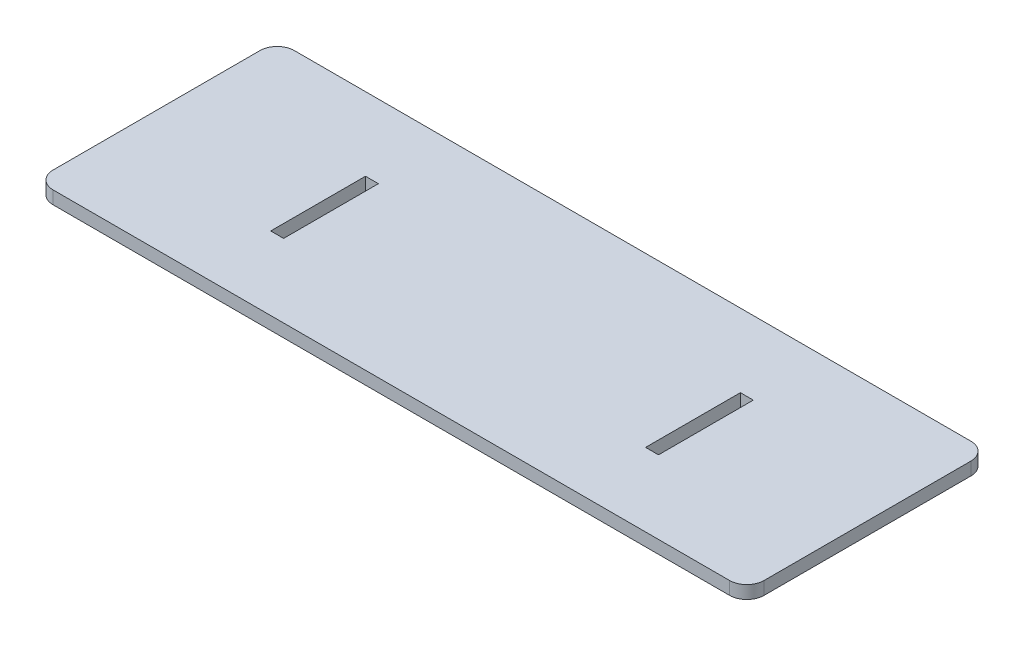
ISO-10303-21;
HEADER;
FILE_DESCRIPTION(('STEP AP214'),'2;1');
FILE_NAME('part.step','',(''),(''),'','','');
FILE_SCHEMA(('AUTOMOTIVE_DESIGN { 1 0 10303 214 1 1 1 1 }'));
ENDSEC;
DATA;
#1=APPLICATION_CONTEXT('core data for automotive mechanical design processes');
#2=APPLICATION_PROTOCOL_DEFINITION('international standard','automotive_design',2000,#1);
#3=PRODUCT_CONTEXT('',#1,'mechanical');
#4=PRODUCT('Part','Part','',(#3));
#5=PRODUCT_RELATED_PRODUCT_CATEGORY('part','',(#4));
#6=PRODUCT_DEFINITION_FORMATION('','',#4);
#7=PRODUCT_DEFINITION_CONTEXT('part definition',#1,'design');
#8=PRODUCT_DEFINITION('design','',#6,#7);
#9=PRODUCT_DEFINITION_SHAPE('','',#8);
#10=(LENGTH_UNIT() NAMED_UNIT(*) SI_UNIT(.MILLI.,.METRE.));
#11=(NAMED_UNIT(*) PLANE_ANGLE_UNIT() SI_UNIT($,.RADIAN.));
#12=(NAMED_UNIT(*) SI_UNIT($,.STERADIAN.) SOLID_ANGLE_UNIT());
#13=UNCERTAINTY_MEASURE_WITH_UNIT(LENGTH_MEASURE(1.E-05),#10,'distance_accuracy_value','');
#14=(GEOMETRIC_REPRESENTATION_CONTEXT(3) GLOBAL_UNCERTAINTY_ASSIGNED_CONTEXT((#13)) GLOBAL_UNIT_ASSIGNED_CONTEXT((#10,
#11,#12)) REPRESENTATION_CONTEXT('',''));
#15=CARTESIAN_POINT('',(0.,0.,0.));
#16=DIRECTION('',(0.,0.,1.));
#17=DIRECTION('',(1.,0.,0.));
#18=AXIS2_PLACEMENT_3D('',#15,#16,#17);
#19=CARTESIAN_POINT('',(-78.5,3.,24.));
#20=DIRECTION('',(0.,-1.,0.));
#21=DIRECTION('',(0.,0.,-1.));
#22=AXIS2_PLACEMENT_3D('',#19,#20,#21);
#23=CYLINDRICAL_SURFACE('',#22,4.);
#24=CARTESIAN_POINT('',(-78.5,0.,24.));
#25=DIRECTION('',(0.,1.,0.));
#26=DIRECTION('',(0.,0.,1.));
#27=AXIS2_PLACEMENT_3D('',#24,#25,#26);
#28=CIRCLE('',#27,4.);
#29=CARTESIAN_POINT('',(-82.5,0.,24.));
#30=VERTEX_POINT('',#29);
#31=CARTESIAN_POINT('',(-78.5,0.,28.));
#32=VERTEX_POINT('',#31);
#33=EDGE_CURVE('E182',#30,#32,#28,.T.);
#34=ORIENTED_EDGE('',*,*,#33,.T.);
#35=DIRECTION('',(0.,-1.,0.));
#36=VECTOR('',#35,1.);
#37=CARTESIAN_POINT('',(-78.5,3.,28.));
#38=LINE('',#37,#36);
#39=CARTESIAN_POINT('',(-78.5,3.,28.));
#40=VERTEX_POINT('',#39);
#41=EDGE_CURVE('E257',#40,#32,#38,.T.);
#42=ORIENTED_EDGE('',*,*,#41,.F.);
#43=CARTESIAN_POINT('',(-78.5,3.,24.));
#44=DIRECTION('',(0.,1.,0.));
#45=DIRECTION('',(0.,0.,1.));
#46=AXIS2_PLACEMENT_3D('',#43,#44,#45);
#47=CIRCLE('',#46,4.);
#48=CARTESIAN_POINT('',(-82.5,3.,24.));
#49=VERTEX_POINT('',#48);
#50=EDGE_CURVE('E203',#49,#40,#47,.T.);
#51=ORIENTED_EDGE('',*,*,#50,.F.);
#52=DIRECTION('',(0.,-1.,0.));
#53=VECTOR('',#52,1.);
#54=CARTESIAN_POINT('',(-82.5,3.,24.));
#55=LINE('',#54,#53);
#56=EDGE_CURVE('E221',#49,#30,#55,.T.);
#57=ORIENTED_EDGE('',*,*,#56,.T.);
#58=EDGE_LOOP('',(#34,#42,#51,#57));
#59=FACE_BOUND('',#58,.T.);
#60=ADVANCED_FACE('F39',(#59),#23,.T.);
#61=CARTESIAN_POINT('',(-78.5,3.,28.));
#62=DIRECTION('',(0.,0.,-1.));
#63=DIRECTION('',(-1.,0.,0.));
#64=AXIS2_PLACEMENT_3D('',#61,#62,#63);
#65=PLANE('',#64);
#66=DIRECTION('',(1.,0.,0.));
#67=VECTOR('',#66,1.);
#68=CARTESIAN_POINT('',(-78.5,0.,28.));
#69=LINE('',#68,#67);
#70=CARTESIAN_POINT('',(78.5,0.,28.));
#71=VERTEX_POINT('',#70);
#72=EDGE_CURVE('E224',#32,#71,#69,.T.);
#73=ORIENTED_EDGE('',*,*,#72,.T.);
#74=DIRECTION('',(0.,-1.,0.));
#75=VECTOR('',#74,1.);
#76=CARTESIAN_POINT('',(78.5,3.,28.));
#77=LINE('',#76,#75);
#78=CARTESIAN_POINT('',(78.5,3.,28.));
#79=VERTEX_POINT('',#78);
#80=EDGE_CURVE('E254',#79,#71,#77,.T.);
#81=ORIENTED_EDGE('',*,*,#80,.F.);
#82=DIRECTION('',(1.,0.,0.));
#83=VECTOR('',#82,1.);
#84=CARTESIAN_POINT('',(-78.5,3.,28.));
#85=LINE('',#84,#83);
#86=EDGE_CURVE('E206',#40,#79,#85,.T.);
#87=ORIENTED_EDGE('',*,*,#86,.F.);
#88=ORIENTED_EDGE('',*,*,#41,.T.);
#89=EDGE_LOOP('',(#73,#81,#87,#88));
#90=FACE_BOUND('',#89,.T.);
#91=ADVANCED_FACE('F296',(#90),#65,.F.);
#92=CARTESIAN_POINT('',(78.5,3.,24.));
#93=DIRECTION('',(0.,-1.,0.));
#94=DIRECTION('',(0.,0.,-1.));
#95=AXIS2_PLACEMENT_3D('',#92,#93,#94);
#96=CYLINDRICAL_SURFACE('',#95,4.);
#97=CARTESIAN_POINT('',(78.5,0.,24.));
#98=DIRECTION('',(0.,1.,0.));
#99=DIRECTION('',(0.,0.,1.));
#100=AXIS2_PLACEMENT_3D('',#97,#98,#99);
#101=CIRCLE('',#100,4.);
#102=CARTESIAN_POINT('',(82.5,0.,24.));
#103=VERTEX_POINT('',#102);
#104=EDGE_CURVE('E226',#71,#103,#101,.T.);
#105=ORIENTED_EDGE('',*,*,#104,.T.);
#106=DIRECTION('',(0.,-1.,0.));
#107=VECTOR('',#106,1.);
#108=CARTESIAN_POINT('',(82.5,3.,24.));
#109=LINE('',#108,#107);
#110=CARTESIAN_POINT('',(82.5,3.,24.));
#111=VERTEX_POINT('',#110);
#112=EDGE_CURVE('E251',#111,#103,#109,.T.);
#113=ORIENTED_EDGE('',*,*,#112,.F.);
#114=CARTESIAN_POINT('',(78.5,3.,24.));
#115=DIRECTION('',(0.,1.,0.));
#116=DIRECTION('',(0.,0.,1.));
#117=AXIS2_PLACEMENT_3D('',#114,#115,#116);
#118=CIRCLE('',#117,4.);
#119=EDGE_CURVE('E209',#79,#111,#118,.T.);
#120=ORIENTED_EDGE('',*,*,#119,.F.);
#121=ORIENTED_EDGE('',*,*,#80,.T.);
#122=EDGE_LOOP('',(#105,#113,#120,#121));
#123=FACE_BOUND('',#122,.T.);
#124=ADVANCED_FACE('F301',(#123),#96,.T.);
#125=CARTESIAN_POINT('',(82.5,3.,24.));
#126=DIRECTION('',(-1.,0.,0.));
#127=DIRECTION('',(0.,0.,1.));
#128=AXIS2_PLACEMENT_3D('',#125,#126,#127);
#129=PLANE('',#128);
#130=DIRECTION('',(0.,0.,-1.));
#131=VECTOR('',#130,1.);
#132=CARTESIAN_POINT('',(82.5,0.,24.));
#133=LINE('',#132,#131);
#134=CARTESIAN_POINT('',(82.5,0.,-24.));
#135=VERTEX_POINT('',#134);
#136=EDGE_CURVE('E228',#103,#135,#133,.T.);
#137=ORIENTED_EDGE('',*,*,#136,.T.);
#138=DIRECTION('',(0.,-1.,0.));
#139=VECTOR('',#138,1.);
#140=CARTESIAN_POINT('',(82.5,3.,-24.));
#141=LINE('',#140,#139);
#142=CARTESIAN_POINT('',(82.5,3.,-24.));
#143=VERTEX_POINT('',#142);
#144=EDGE_CURVE('E248',#143,#135,#141,.T.);
#145=ORIENTED_EDGE('',*,*,#144,.F.);
#146=DIRECTION('',(0.,0.,-1.));
#147=VECTOR('',#146,1.);
#148=CARTESIAN_POINT('',(82.5,3.,24.));
#149=LINE('',#148,#147);
#150=EDGE_CURVE('E211',#111,#143,#149,.T.);
#151=ORIENTED_EDGE('',*,*,#150,.F.);
#152=ORIENTED_EDGE('',*,*,#112,.T.);
#153=EDGE_LOOP('',(#137,#145,#151,#152));
#154=FACE_BOUND('',#153,.T.);
#155=ADVANCED_FACE('F335',(#154),#129,.F.);
#156=CARTESIAN_POINT('',(78.5,3.,-24.));
#157=DIRECTION('',(0.,-1.,0.));
#158=DIRECTION('',(0.,0.,-1.));
#159=AXIS2_PLACEMENT_3D('',#156,#157,#158);
#160=CYLINDRICAL_SURFACE('',#159,4.);
#161=CARTESIAN_POINT('',(78.5,0.,-24.));
#162=DIRECTION('',(0.,1.,0.));
#163=DIRECTION('',(0.,0.,1.));
#164=AXIS2_PLACEMENT_3D('',#161,#162,#163);
#165=CIRCLE('',#164,4.);
#166=CARTESIAN_POINT('',(78.5,0.,-28.));
#167=VERTEX_POINT('',#166);
#168=EDGE_CURVE('E230',#135,#167,#165,.T.);
#169=ORIENTED_EDGE('',*,*,#168,.T.);
#170=DIRECTION('',(0.,-1.,0.));
#171=VECTOR('',#170,1.);
#172=CARTESIAN_POINT('',(78.5,3.,-28.));
#173=LINE('',#172,#171);
#174=CARTESIAN_POINT('',(78.5,3.,-28.));
#175=VERTEX_POINT('',#174);
#176=EDGE_CURVE('E245',#175,#167,#173,.T.);
#177=ORIENTED_EDGE('',*,*,#176,.F.);
#178=CARTESIAN_POINT('',(78.5,3.,-24.));
#179=DIRECTION('',(0.,1.,0.));
#180=DIRECTION('',(0.,0.,1.));
#181=AXIS2_PLACEMENT_3D('',#178,#179,#180);
#182=CIRCLE('',#181,4.);
#183=EDGE_CURVE('E213',#143,#175,#182,.T.);
#184=ORIENTED_EDGE('',*,*,#183,.F.);
#185=ORIENTED_EDGE('',*,*,#144,.T.);
#186=EDGE_LOOP('',(#169,#177,#184,#185));
#187=FACE_BOUND('',#186,.T.);
#188=ADVANCED_FACE('F331',(#187),#160,.T.);
#189=CARTESIAN_POINT('',(78.5,3.,-28.));
#190=DIRECTION('',(0.,0.,1.));
#191=DIRECTION('',(1.,0.,0.));
#192=AXIS2_PLACEMENT_3D('',#189,#190,#191);
#193=PLANE('',#192);
#194=DIRECTION('',(-1.,0.,0.));
#195=VECTOR('',#194,1.);
#196=CARTESIAN_POINT('',(78.5,0.,-28.));
#197=LINE('',#196,#195);
#198=CARTESIAN_POINT('',(-78.5,0.,-28.));
#199=VERTEX_POINT('',#198);
#200=EDGE_CURVE('E232',#167,#199,#197,.T.);
#201=ORIENTED_EDGE('',*,*,#200,.T.);
#202=DIRECTION('',(0.,-1.,0.));
#203=VECTOR('',#202,1.);
#204=CARTESIAN_POINT('',(-78.5,3.,-28.));
#205=LINE('',#204,#203);
#206=CARTESIAN_POINT('',(-78.5,3.,-28.));
#207=VERTEX_POINT('',#206);
#208=EDGE_CURVE('E242',#207,#199,#205,.T.);
#209=ORIENTED_EDGE('',*,*,#208,.F.);
#210=DIRECTION('',(-1.,0.,0.));
#211=VECTOR('',#210,1.);
#212=CARTESIAN_POINT('',(78.5,3.,-28.));
#213=LINE('',#212,#211);
#214=EDGE_CURVE('E215',#175,#207,#213,.T.);
#215=ORIENTED_EDGE('',*,*,#214,.F.);
#216=ORIENTED_EDGE('',*,*,#176,.T.);
#217=EDGE_LOOP('',(#201,#209,#215,#216));
#218=FACE_BOUND('',#217,.T.);
#219=ADVANCED_FACE('F326',(#218),#193,.F.);
#220=CARTESIAN_POINT('',(-78.5,3.,-24.));
#221=DIRECTION('',(0.,-1.,0.));
#222=DIRECTION('',(0.,0.,-1.));
#223=AXIS2_PLACEMENT_3D('',#220,#221,#222);
#224=CYLINDRICAL_SURFACE('',#223,4.);
#225=CARTESIAN_POINT('',(-78.5,0.,-24.));
#226=DIRECTION('',(0.,1.,0.));
#227=DIRECTION('',(0.,0.,1.));
#228=AXIS2_PLACEMENT_3D('',#225,#226,#227);
#229=CIRCLE('',#228,4.);
#230=CARTESIAN_POINT('',(-82.5,0.,-24.));
#231=VERTEX_POINT('',#230);
#232=EDGE_CURVE('E234',#199,#231,#229,.T.);
#233=ORIENTED_EDGE('',*,*,#232,.T.);
#234=DIRECTION('',(0.,-1.,0.));
#235=VECTOR('',#234,1.);
#236=CARTESIAN_POINT('',(-82.5,3.,-24.));
#237=LINE('',#236,#235);
#238=CARTESIAN_POINT('',(-82.5,3.,-24.));
#239=VERTEX_POINT('',#238);
#240=EDGE_CURVE('E239',#239,#231,#237,.T.);
#241=ORIENTED_EDGE('',*,*,#240,.F.);
#242=CARTESIAN_POINT('',(-78.5,3.,-24.));
#243=DIRECTION('',(0.,1.,0.));
#244=DIRECTION('',(0.,0.,1.));
#245=AXIS2_PLACEMENT_3D('',#242,#243,#244);
#246=CIRCLE('',#245,4.);
#247=EDGE_CURVE('E217',#207,#239,#246,.T.);
#248=ORIENTED_EDGE('',*,*,#247,.F.);
#249=ORIENTED_EDGE('',*,*,#208,.T.);
#250=EDGE_LOOP('',(#233,#241,#248,#249));
#251=FACE_BOUND('',#250,.T.);
#252=ADVANCED_FACE('F321',(#251),#224,.T.);
#253=CARTESIAN_POINT('',(-82.5,3.,-24.));
#254=DIRECTION('',(1.,0.,0.));
#255=DIRECTION('',(0.,0.,-1.));
#256=AXIS2_PLACEMENT_3D('',#253,#254,#255);
#257=PLANE('',#256);
#258=DIRECTION('',(0.,0.,1.));
#259=VECTOR('',#258,1.);
#260=CARTESIAN_POINT('',(-82.5,0.,-24.));
#261=LINE('',#260,#259);
#262=EDGE_CURVE('E207',#231,#30,#261,.T.);
#263=ORIENTED_EDGE('',*,*,#262,.T.);
#264=ORIENTED_EDGE('',*,*,#56,.F.);
#265=DIRECTION('',(0.,0.,1.));
#266=VECTOR('',#265,1.);
#267=CARTESIAN_POINT('',(-82.5,3.,-24.));
#268=LINE('',#267,#266);
#269=EDGE_CURVE('E219',#239,#49,#268,.T.);
#270=ORIENTED_EDGE('',*,*,#269,.F.);
#271=ORIENTED_EDGE('',*,*,#240,.T.);
#272=EDGE_LOOP('',(#263,#264,#270,#271));
#273=FACE_BOUND('',#272,.T.);
#274=ADVANCED_FACE('F319',(#273),#257,.F.);
#275=CARTESIAN_POINT('',(-78.5,3.,24.));
#276=DIRECTION('',(0.,1.,0.));
#277=DIRECTION('',(0.,0.,1.));
#278=AXIS2_PLACEMENT_3D('',#275,#276,#277);
#279=PLANE('',#278);
#280=DIRECTION('',(0.,0.,1.));
#281=VECTOR('',#280,1.);
#282=CARTESIAN_POINT('',(-45.,3.,11.));
#283=LINE('',#282,#281);
#284=CARTESIAN_POINT('',(-45.,3.,-11.));
#285=VERTEX_POINT('',#284);
#286=CARTESIAN_POINT('',(-45.,3.,11.));
#287=VERTEX_POINT('',#286);
#288=EDGE_CURVE('E53',#285,#287,#283,.T.);
#289=ORIENTED_EDGE('',*,*,#288,.F.);
#290=DIRECTION('',(-1.,0.,0.));
#291=VECTOR('',#290,1.);
#292=CARTESIAN_POINT('',(-45.,3.,-11.));
#293=LINE('',#292,#291);
#294=CARTESIAN_POINT('',(-42.,3.,-11.));
#295=VERTEX_POINT('',#294);
#296=EDGE_CURVE('E175',#295,#285,#293,.T.);
#297=ORIENTED_EDGE('',*,*,#296,.F.);
#298=DIRECTION('',(0.,0.,-1.));
#299=VECTOR('',#298,1.);
#300=CARTESIAN_POINT('',(-42.,3.,-11.));
#301=LINE('',#300,#299);
#302=CARTESIAN_POINT('',(-42.,3.,11.));
#303=VERTEX_POINT('',#302);
#304=EDGE_CURVE('E158',#303,#295,#301,.T.);
#305=ORIENTED_EDGE('',*,*,#304,.F.);
#306=DIRECTION('',(1.,0.,0.));
#307=VECTOR('',#306,1.);
#308=CARTESIAN_POINT('',(-42.,3.,11.));
#309=LINE('',#308,#307);
#310=EDGE_CURVE('E168',#287,#303,#309,.T.);
#311=ORIENTED_EDGE('',*,*,#310,.F.);
#312=EDGE_LOOP('',(#289,#297,#305,#311));
#313=FACE_BOUND('',#312,.T.);
#314=DIRECTION('',(0.,0.,1.));
#315=VECTOR('',#314,1.);
#316=CARTESIAN_POINT('',(42.,3.,11.));
#317=LINE('',#316,#315);
#318=CARTESIAN_POINT('',(42.,3.,-11.));
#319=VERTEX_POINT('',#318);
#320=CARTESIAN_POINT('',(42.,3.,11.));
#321=VERTEX_POINT('',#320);
#322=EDGE_CURVE('E61',#319,#321,#317,.T.);
#323=ORIENTED_EDGE('',*,*,#322,.F.);
#324=DIRECTION('',(-1.,0.,0.));
#325=VECTOR('',#324,1.);
#326=CARTESIAN_POINT('',(42.,3.,-11.));
#327=LINE('',#326,#325);
#328=CARTESIAN_POINT('',(45.,3.,-11.));
#329=VERTEX_POINT('',#328);
#330=EDGE_CURVE('E187',#329,#319,#327,.T.);
#331=ORIENTED_EDGE('',*,*,#330,.F.);
#332=DIRECTION('',(0.,0.,-1.));
#333=VECTOR('',#332,1.);
#334=CARTESIAN_POINT('',(45.,3.,-11.));
#335=LINE('',#334,#333);
#336=CARTESIAN_POINT('',(45.,3.,11.));
#337=VERTEX_POINT('',#336);
#338=EDGE_CURVE('E196',#337,#329,#335,.T.);
#339=ORIENTED_EDGE('',*,*,#338,.F.);
#340=DIRECTION('',(1.,0.,0.));
#341=VECTOR('',#340,1.);
#342=CARTESIAN_POINT('',(45.,3.,11.));
#343=LINE('',#342,#341);
#344=EDGE_CURVE('E199',#321,#337,#343,.T.);
#345=ORIENTED_EDGE('',*,*,#344,.F.);
#346=EDGE_LOOP('',(#323,#331,#339,#345));
#347=FACE_BOUND('',#346,.T.);
#348=ORIENTED_EDGE('',*,*,#50,.T.);
#349=ORIENTED_EDGE('',*,*,#86,.T.);
#350=ORIENTED_EDGE('',*,*,#119,.T.);
#351=ORIENTED_EDGE('',*,*,#150,.T.);
#352=ORIENTED_EDGE('',*,*,#183,.T.);
#353=ORIENTED_EDGE('',*,*,#214,.T.);
#354=ORIENTED_EDGE('',*,*,#247,.T.);
#355=ORIENTED_EDGE('',*,*,#269,.T.);
#356=EDGE_LOOP('',(#348,#349,#350,#351,#352,#353,#354,#355));
#357=FACE_BOUND('',#356,.T.);
#358=ADVANCED_FACE('F172',(#313,#347,#357),#279,.T.);
#359=CARTESIAN_POINT('',(-78.5,0.,24.));
#360=DIRECTION('',(0.,1.,0.));
#361=DIRECTION('',(0.,0.,1.));
#362=AXIS2_PLACEMENT_3D('',#359,#360,#361);
#363=PLANE('',#362);
#364=DIRECTION('',(-1.,0.,0.));
#365=VECTOR('',#364,1.);
#366=CARTESIAN_POINT('',(-78.5,0.,-11.));
#367=LINE('',#366,#365);
#368=CARTESIAN_POINT('',(-42.,0.,-11.));
#369=VERTEX_POINT('',#368);
#370=CARTESIAN_POINT('',(-45.,0.,-11.));
#371=VERTEX_POINT('',#370);
#372=EDGE_CURVE('E46',#369,#371,#367,.T.);
#373=ORIENTED_EDGE('',*,*,#372,.T.);
#374=DIRECTION('',(0.,0.,1.));
#375=VECTOR('',#374,1.);
#376=CARTESIAN_POINT('',(-45.,0.,24.));
#377=LINE('',#376,#375);
#378=CARTESIAN_POINT('',(-45.,0.,11.));
#379=VERTEX_POINT('',#378);
#380=EDGE_CURVE('E11',#371,#379,#377,.T.);
#381=ORIENTED_EDGE('',*,*,#380,.T.);
#382=DIRECTION('',(1.,0.,0.));
#383=VECTOR('',#382,1.);
#384=CARTESIAN_POINT('',(-78.5,0.,11.));
#385=LINE('',#384,#383);
#386=CARTESIAN_POINT('',(-42.,0.,11.));
#387=VERTEX_POINT('',#386);
#388=EDGE_CURVE('E272',#379,#387,#385,.T.);
#389=ORIENTED_EDGE('',*,*,#388,.T.);
#390=DIRECTION('',(0.,0.,-1.));
#391=VECTOR('',#390,1.);
#392=CARTESIAN_POINT('',(-42.,0.,24.));
#393=LINE('',#392,#391);
#394=EDGE_CURVE('E161',#387,#369,#393,.T.);
#395=ORIENTED_EDGE('',*,*,#394,.T.);
#396=EDGE_LOOP('',(#373,#381,#389,#395));
#397=FACE_BOUND('',#396,.T.);
#398=DIRECTION('',(-1.,0.,0.));
#399=VECTOR('',#398,1.);
#400=CARTESIAN_POINT('',(-78.5,0.,-11.));
#401=LINE('',#400,#399);
#402=CARTESIAN_POINT('',(45.,0.,-11.));
#403=VERTEX_POINT('',#402);
#404=CARTESIAN_POINT('',(42.,0.,-11.));
#405=VERTEX_POINT('',#404);
#406=EDGE_CURVE('E266',#403,#405,#401,.T.);
#407=ORIENTED_EDGE('',*,*,#406,.T.);
#408=DIRECTION('',(0.,0.,1.));
#409=VECTOR('',#408,1.);
#410=CARTESIAN_POINT('',(42.,0.,24.));
#411=LINE('',#410,#409);
#412=CARTESIAN_POINT('',(42.,0.,11.));
#413=VERTEX_POINT('',#412);
#414=EDGE_CURVE('E269',#405,#413,#411,.T.);
#415=ORIENTED_EDGE('',*,*,#414,.T.);
#416=DIRECTION('',(1.,0.,0.));
#417=VECTOR('',#416,1.);
#418=CARTESIAN_POINT('',(-78.5,0.,11.));
#419=LINE('',#418,#417);
#420=CARTESIAN_POINT('',(45.,0.,11.));
#421=VERTEX_POINT('',#420);
#422=EDGE_CURVE('E260',#413,#421,#419,.T.);
#423=ORIENTED_EDGE('',*,*,#422,.T.);
#424=DIRECTION('',(0.,0.,-1.));
#425=VECTOR('',#424,1.);
#426=CARTESIAN_POINT('',(45.,0.,24.));
#427=LINE('',#426,#425);
#428=EDGE_CURVE('E263',#421,#403,#427,.T.);
#429=ORIENTED_EDGE('',*,*,#428,.T.);
#430=EDGE_LOOP('',(#407,#415,#423,#429));
#431=FACE_BOUND('',#430,.T.);
#432=ORIENTED_EDGE('',*,*,#33,.F.);
#433=ORIENTED_EDGE('',*,*,#262,.F.);
#434=ORIENTED_EDGE('',*,*,#232,.F.);
#435=ORIENTED_EDGE('',*,*,#200,.F.);
#436=ORIENTED_EDGE('',*,*,#168,.F.);
#437=ORIENTED_EDGE('',*,*,#136,.F.);
#438=ORIENTED_EDGE('',*,*,#104,.F.);
#439=ORIENTED_EDGE('',*,*,#72,.F.);
#440=EDGE_LOOP('',(#432,#433,#434,#435,#436,#437,#438,#439));
#441=FACE_BOUND('',#440,.T.);
#442=ADVANCED_FACE('F276',(#397,#431,#441),#363,.F.);
#443=CARTESIAN_POINT('',(42.,-1.2E-05,11.));
#444=DIRECTION('',(-1.,0.,0.));
#445=DIRECTION('',(0.,0.,1.));
#446=AXIS2_PLACEMENT_3D('',#443,#444,#445);
#447=PLANE('',#446);
#448=DIRECTION('',(0.,1.,0.));
#449=VECTOR('',#448,1.);
#450=CARTESIAN_POINT('',(42.,-1.2E-05,-11.));
#451=LINE('',#450,#449);
#452=EDGE_CURVE('E192',#405,#319,#451,.T.);
#453=ORIENTED_EDGE('',*,*,#452,.T.);
#454=ORIENTED_EDGE('',*,*,#322,.T.);
#455=DIRECTION('',(0.,1.,0.));
#456=VECTOR('',#455,1.);
#457=CARTESIAN_POINT('',(42.,-1.2E-05,11.));
#458=LINE('',#457,#456);
#459=EDGE_CURVE('E185',#413,#321,#458,.T.);
#460=ORIENTED_EDGE('',*,*,#459,.F.);
#461=ORIENTED_EDGE('',*,*,#414,.F.);
#462=EDGE_LOOP('',(#453,#454,#460,#461));
#463=FACE_BOUND('',#462,.T.);
#464=ADVANCED_FACE('F355',(#463),#447,.F.);
#465=CARTESIAN_POINT('',(42.,-1.2E-05,-11.));
#466=DIRECTION('',(0.,0.,-1.));
#467=DIRECTION('',(-1.,0.,0.));
#468=AXIS2_PLACEMENT_3D('',#465,#466,#467);
#469=PLANE('',#468);
#470=DIRECTION('',(0.,1.,0.));
#471=VECTOR('',#470,1.);
#472=CARTESIAN_POINT('',(45.,-1.2E-05,-11.));
#473=LINE('',#472,#471);
#474=EDGE_CURVE('E190',#403,#329,#473,.T.);
#475=ORIENTED_EDGE('',*,*,#474,.T.);
#476=ORIENTED_EDGE('',*,*,#330,.T.);
#477=ORIENTED_EDGE('',*,*,#452,.F.);
#478=ORIENTED_EDGE('',*,*,#406,.F.);
#479=EDGE_LOOP('',(#475,#476,#477,#478));
#480=FACE_BOUND('',#479,.T.);
#481=ADVANCED_FACE('F358',(#480),#469,.F.);
#482=CARTESIAN_POINT('',(45.,-1.2E-05,-11.));
#483=DIRECTION('',(1.,0.,0.));
#484=DIRECTION('',(0.,0.,-1.));
#485=AXIS2_PLACEMENT_3D('',#482,#483,#484);
#486=PLANE('',#485);
#487=DIRECTION('',(0.,1.,0.));
#488=VECTOR('',#487,1.);
#489=CARTESIAN_POINT('',(45.,-1.2E-05,11.));
#490=LINE('',#489,#488);
#491=EDGE_CURVE('E188',#421,#337,#490,.T.);
#492=ORIENTED_EDGE('',*,*,#491,.T.);
#493=ORIENTED_EDGE('',*,*,#338,.T.);
#494=ORIENTED_EDGE('',*,*,#474,.F.);
#495=ORIENTED_EDGE('',*,*,#428,.F.);
#496=EDGE_LOOP('',(#492,#493,#494,#495));
#497=FACE_BOUND('',#496,.T.);
#498=ADVANCED_FACE('F290',(#497),#486,.F.);
#499=CARTESIAN_POINT('',(45.,-1.2E-05,11.));
#500=DIRECTION('',(0.,0.,1.));
#501=DIRECTION('',(1.,0.,0.));
#502=AXIS2_PLACEMENT_3D('',#499,#500,#501);
#503=PLANE('',#502);
#504=ORIENTED_EDGE('',*,*,#459,.T.);
#505=ORIENTED_EDGE('',*,*,#344,.T.);
#506=ORIENTED_EDGE('',*,*,#491,.F.);
#507=ORIENTED_EDGE('',*,*,#422,.F.);
#508=EDGE_LOOP('',(#504,#505,#506,#507));
#509=FACE_BOUND('',#508,.T.);
#510=ADVANCED_FACE('F283',(#509),#503,.F.);
#511=CARTESIAN_POINT('',(-45.,-1.2E-05,11.));
#512=DIRECTION('',(-1.,0.,0.));
#513=DIRECTION('',(0.,0.,1.));
#514=AXIS2_PLACEMENT_3D('',#511,#512,#513);
#515=PLANE('',#514);
#516=DIRECTION('',(0.,1.,0.));
#517=VECTOR('',#516,1.);
#518=CARTESIAN_POINT('',(-45.,-1.2E-05,-11.));
#519=LINE('',#518,#517);
#520=EDGE_CURVE('E180',#371,#285,#519,.T.);
#521=ORIENTED_EDGE('',*,*,#520,.T.);
#522=ORIENTED_EDGE('',*,*,#288,.T.);
#523=DIRECTION('',(0.,1.,0.));
#524=VECTOR('',#523,1.);
#525=CARTESIAN_POINT('',(-45.,-1.2E-05,11.));
#526=LINE('',#525,#524);
#527=EDGE_CURVE('E165',#379,#287,#526,.T.);
#528=ORIENTED_EDGE('',*,*,#527,.F.);
#529=ORIENTED_EDGE('',*,*,#380,.F.);
#530=EDGE_LOOP('',(#521,#522,#528,#529));
#531=FACE_BOUND('',#530,.T.);
#532=ADVANCED_FACE('F281',(#531),#515,.F.);
#533=CARTESIAN_POINT('',(-45.,-1.2E-05,-11.));
#534=DIRECTION('',(0.,0.,-1.));
#535=DIRECTION('',(-1.,0.,0.));
#536=AXIS2_PLACEMENT_3D('',#533,#534,#535);
#537=PLANE('',#536);
#538=DIRECTION('',(0.,1.,0.));
#539=VECTOR('',#538,1.);
#540=CARTESIAN_POINT('',(-42.,-1.2E-05,-11.));
#541=LINE('',#540,#539);
#542=EDGE_CURVE('E164',#369,#295,#541,.T.);
#543=ORIENTED_EDGE('',*,*,#542,.T.);
#544=ORIENTED_EDGE('',*,*,#296,.T.);
#545=ORIENTED_EDGE('',*,*,#520,.F.);
#546=ORIENTED_EDGE('',*,*,#372,.F.);
#547=EDGE_LOOP('',(#543,#544,#545,#546));
#548=FACE_BOUND('',#547,.T.);
#549=ADVANCED_FACE('F280',(#548),#537,.F.);
#550=CARTESIAN_POINT('',(-42.,-1.2E-05,-11.));
#551=DIRECTION('',(1.,0.,0.));
#552=DIRECTION('',(0.,0.,-1.));
#553=AXIS2_PLACEMENT_3D('',#550,#551,#552);
#554=PLANE('',#553);
#555=DIRECTION('',(0.,1.,0.));
#556=VECTOR('',#555,1.);
#557=CARTESIAN_POINT('',(-42.,-1.2E-05,11.));
#558=LINE('',#557,#556);
#559=EDGE_CURVE('E153',#387,#303,#558,.T.);
#560=ORIENTED_EDGE('',*,*,#559,.T.);
#561=ORIENTED_EDGE('',*,*,#304,.T.);
#562=ORIENTED_EDGE('',*,*,#542,.F.);
#563=ORIENTED_EDGE('',*,*,#394,.F.);
#564=EDGE_LOOP('',(#560,#561,#562,#563));
#565=FACE_BOUND('',#564,.T.);
#566=ADVANCED_FACE('F155',(#565),#554,.F.);
#567=CARTESIAN_POINT('',(-42.,-1.2E-05,11.));
#568=DIRECTION('',(0.,0.,1.));
#569=DIRECTION('',(1.,0.,0.));
#570=AXIS2_PLACEMENT_3D('',#567,#568,#569);
#571=PLANE('',#570);
#572=ORIENTED_EDGE('',*,*,#527,.T.);
#573=ORIENTED_EDGE('',*,*,#310,.T.);
#574=ORIENTED_EDGE('',*,*,#559,.F.);
#575=ORIENTED_EDGE('',*,*,#388,.F.);
#576=EDGE_LOOP('',(#572,#573,#574,#575));
#577=FACE_BOUND('',#576,.T.);
#578=ADVANCED_FACE('F169',(#577),#571,.F.);
#579=CLOSED_SHELL('',(#60,#91,#124,#155,#188,#219,#252,#274,#358,#442,#464,#481,#498,#510,#532,
#549,#566,#578));
#580=MANIFOLD_SOLID_BREP('B2',#579);
#581=ADVANCED_BREP_SHAPE_REPRESENTATION('',(#18,#580),#14);
#582=SHAPE_DEFINITION_REPRESENTATION(#9,#581);
ENDSEC;
END-ISO-10303-21;
